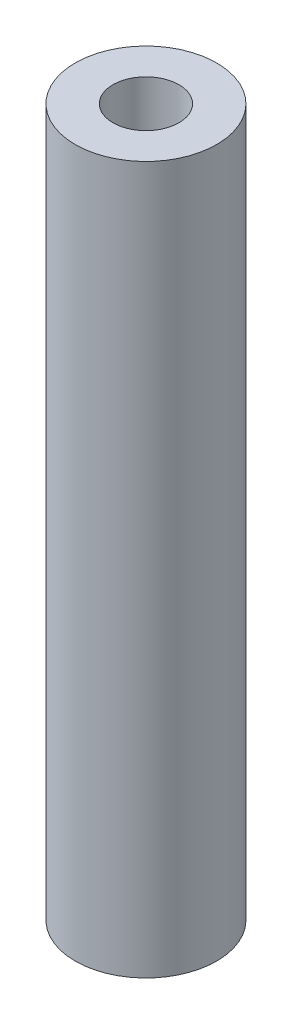
ISO-10303-21;
HEADER;
FILE_DESCRIPTION(('STEP AP214'),'2;1');
FILE_NAME('part.step','',(''),(''),'','','');
FILE_SCHEMA(('AUTOMOTIVE_DESIGN { 1 0 10303 214 1 1 1 1 }'));
ENDSEC;
DATA;
#1=APPLICATION_CONTEXT('core data for automotive mechanical design processes');
#2=APPLICATION_PROTOCOL_DEFINITION('international standard','automotive_design',2000,#1);
#3=PRODUCT_CONTEXT('',#1,'mechanical');
#4=PRODUCT('Part','Part','',(#3));
#5=PRODUCT_RELATED_PRODUCT_CATEGORY('part','',(#4));
#6=PRODUCT_DEFINITION_FORMATION('','',#4);
#7=PRODUCT_DEFINITION_CONTEXT('part definition',#1,'design');
#8=PRODUCT_DEFINITION('design','',#6,#7);
#9=PRODUCT_DEFINITION_SHAPE('','',#8);
#10=(LENGTH_UNIT() NAMED_UNIT(*) SI_UNIT(.MILLI.,.METRE.));
#11=(NAMED_UNIT(*) PLANE_ANGLE_UNIT() SI_UNIT($,.RADIAN.));
#12=(NAMED_UNIT(*) SI_UNIT($,.STERADIAN.) SOLID_ANGLE_UNIT());
#13=UNCERTAINTY_MEASURE_WITH_UNIT(LENGTH_MEASURE(1.E-05),#10,'distance_accuracy_value','');
#14=(GEOMETRIC_REPRESENTATION_CONTEXT(3) GLOBAL_UNCERTAINTY_ASSIGNED_CONTEXT((#13)) GLOBAL_UNIT_ASSIGNED_CONTEXT((#10,
#11,#12)) REPRESENTATION_CONTEXT('',''));
#15=CARTESIAN_POINT('',(0.,0.,0.));
#16=DIRECTION('',(0.,0.,1.));
#17=DIRECTION('',(1.,0.,0.));
#18=AXIS2_PLACEMENT_3D('',#15,#16,#17);
#19=CARTESIAN_POINT('',(0.,30.,0.));
#20=DIRECTION('',(0.,1.,0.));
#21=DIRECTION('',(0.,0.,1.));
#22=AXIS2_PLACEMENT_3D('',#19,#20,#21);
#23=PLANE('',#22);
#24=CARTESIAN_POINT('',(0.,30.,0.));
#25=DIRECTION('',(0.,1.,0.));
#26=DIRECTION('',(0.,0.,1.));
#27=AXIS2_PLACEMENT_3D('',#24,#25,#26);
#28=CIRCLE('',#27,3.);
#29=CARTESIAN_POINT('',(0.,30.,3.));
#30=VERTEX_POINT('',#29);
#31=EDGE_CURVE('E10',#30,#30,#28,.T.);
#32=ORIENTED_EDGE('',*,*,#31,.T.);
#33=EDGE_LOOP('',(#32));
#34=FACE_BOUND('',#33,.T.);
#35=CARTESIAN_POINT('',(0.,30.,0.));
#36=DIRECTION('',(0.,1.,0.));
#37=DIRECTION('',(0.,0.,1.));
#38=AXIS2_PLACEMENT_3D('',#35,#36,#37);
#39=CIRCLE('',#38,1.4);
#40=CARTESIAN_POINT('',(0.,30.,1.4));
#41=VERTEX_POINT('',#40);
#42=EDGE_CURVE('E39',#41,#41,#39,.T.);
#43=ORIENTED_EDGE('',*,*,#42,.F.);
#44=EDGE_LOOP('',(#43));
#45=FACE_BOUND('',#44,.T.);
#46=ADVANCED_FACE('F28',(#34,#45),#23,.T.);
#47=CARTESIAN_POINT('',(0.,0.,0.));
#48=DIRECTION('',(0.,1.,0.));
#49=DIRECTION('',(0.,0.,1.));
#50=AXIS2_PLACEMENT_3D('',#47,#48,#49);
#51=PLANE('',#50);
#52=CARTESIAN_POINT('',(0.,0.,0.));
#53=DIRECTION('',(0.,1.,0.));
#54=DIRECTION('',(0.,0.,1.));
#55=AXIS2_PLACEMENT_3D('',#52,#53,#54);
#56=CIRCLE('',#55,3.);
#57=CARTESIAN_POINT('',(0.,0.,3.));
#58=VERTEX_POINT('',#57);
#59=EDGE_CURVE('E32',#58,#58,#56,.T.);
#60=ORIENTED_EDGE('',*,*,#59,.F.);
#61=EDGE_LOOP('',(#60));
#62=FACE_BOUND('',#61,.T.);
#63=CARTESIAN_POINT('',(0.,0.,0.));
#64=DIRECTION('',(0.,1.,0.));
#65=DIRECTION('',(0.,0.,1.));
#66=AXIS2_PLACEMENT_3D('',#63,#64,#65);
#67=CIRCLE('',#66,1.4);
#68=CARTESIAN_POINT('',(0.,0.,1.4));
#69=VERTEX_POINT('',#68);
#70=EDGE_CURVE('E41',#69,#69,#67,.T.);
#71=ORIENTED_EDGE('',*,*,#70,.T.);
#72=EDGE_LOOP('',(#71));
#73=FACE_BOUND('',#72,.T.);
#74=ADVANCED_FACE('F51',(#62,#73),#51,.F.);
#75=CARTESIAN_POINT('',(0.,30.,0.));
#76=DIRECTION('',(0.,-1.,0.));
#77=DIRECTION('',(0.,0.,-1.));
#78=AXIS2_PLACEMENT_3D('',#75,#76,#77);
#79=CYLINDRICAL_SURFACE('',#78,3.);
#80=ORIENTED_EDGE('',*,*,#31,.F.);
#81=EDGE_LOOP('',(#80));
#82=FACE_BOUND('',#81,.T.);
#83=ORIENTED_EDGE('',*,*,#59,.T.);
#84=EDGE_LOOP('',(#83));
#85=FACE_BOUND('',#84,.T.);
#86=ADVANCED_FACE('F30',(#82,#85),#79,.T.);
#87=CARTESIAN_POINT('',(0.,30.,0.));
#88=DIRECTION('',(0.,-1.,0.));
#89=DIRECTION('',(0.,0.,-1.));
#90=AXIS2_PLACEMENT_3D('',#87,#88,#89);
#91=CYLINDRICAL_SURFACE('',#90,1.4);
#92=ORIENTED_EDGE('',*,*,#42,.T.);
#93=EDGE_LOOP('',(#92));
#94=FACE_BOUND('',#93,.T.);
#95=ORIENTED_EDGE('',*,*,#70,.F.);
#96=EDGE_LOOP('',(#95));
#97=FACE_BOUND('',#96,.T.);
#98=ADVANCED_FACE('F47',(#94,#97),#91,.F.);
#99=CLOSED_SHELL('',(#46,#74,#86,#98));
#100=MANIFOLD_SOLID_BREP('B2',#99);
#101=ADVANCED_BREP_SHAPE_REPRESENTATION('',(#18,#100),#14);
#102=SHAPE_DEFINITION_REPRESENTATION(#9,#101);
ENDSEC;
END-ISO-10303-21;
